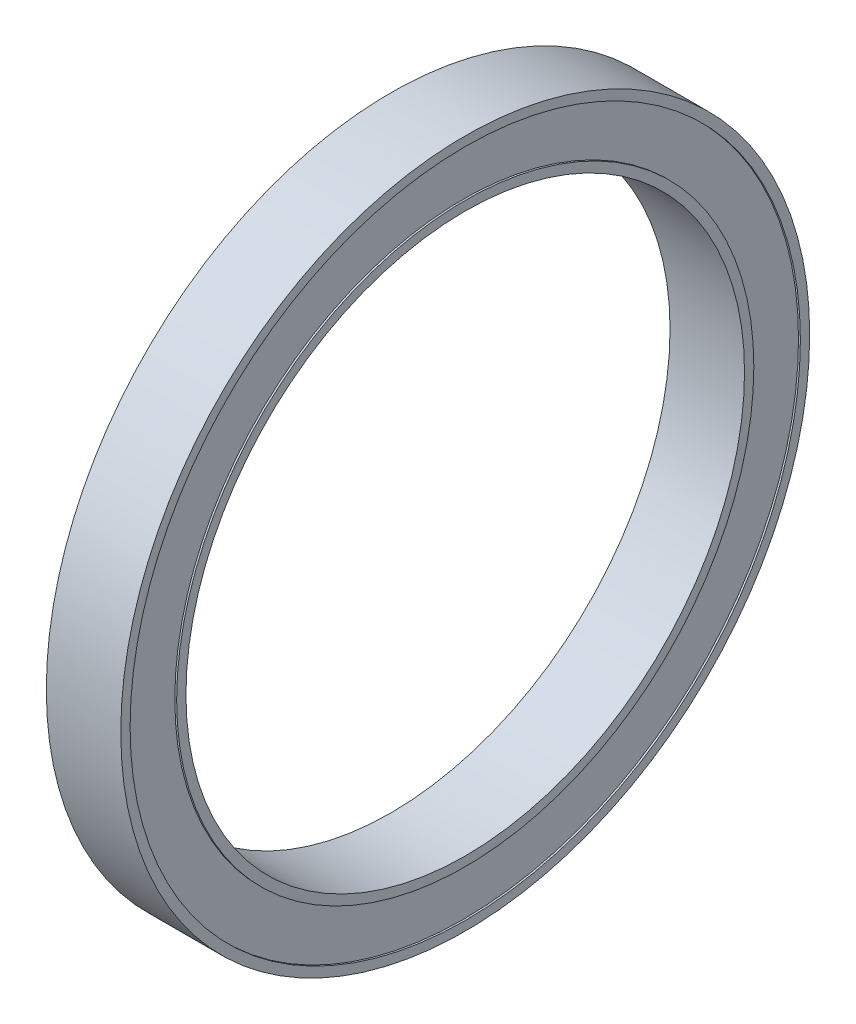
ISO-10303-21;
HEADER;
FILE_DESCRIPTION(('STEP AP214'),'2;1');
FILE_NAME('part.step','',(''),(''),'','','');
FILE_SCHEMA(('AUTOMOTIVE_DESIGN { 1 0 10303 214 1 1 1 1 }'));
ENDSEC;
DATA;
#1=APPLICATION_CONTEXT('core data for automotive mechanical design processes');
#2=APPLICATION_PROTOCOL_DEFINITION('international standard','automotive_design',2000,#1);
#3=PRODUCT_CONTEXT('',#1,'mechanical');
#4=PRODUCT('Part','Part','',(#3));
#5=PRODUCT_RELATED_PRODUCT_CATEGORY('part','',(#4));
#6=PRODUCT_DEFINITION_FORMATION('','',#4);
#7=PRODUCT_DEFINITION_CONTEXT('part definition',#1,'design');
#8=PRODUCT_DEFINITION('design','',#6,#7);
#9=PRODUCT_DEFINITION_SHAPE('','',#8);
#10=(LENGTH_UNIT() NAMED_UNIT(*) SI_UNIT(.MILLI.,.METRE.));
#11=(NAMED_UNIT(*) PLANE_ANGLE_UNIT() SI_UNIT($,.RADIAN.));
#12=(NAMED_UNIT(*) SI_UNIT($,.STERADIAN.) SOLID_ANGLE_UNIT());
#13=UNCERTAINTY_MEASURE_WITH_UNIT(LENGTH_MEASURE(1.E-05),#10,'distance_accuracy_value','');
#14=(GEOMETRIC_REPRESENTATION_CONTEXT(3) GLOBAL_UNCERTAINTY_ASSIGNED_CONTEXT((#13)) GLOBAL_UNIT_ASSIGNED_CONTEXT((#10,
#11,#12)) REPRESENTATION_CONTEXT('',''));
#15=CARTESIAN_POINT('',(0.,0.,0.));
#16=DIRECTION('',(0.,0.,1.));
#17=DIRECTION('',(1.,0.,0.));
#18=AXIS2_PLACEMENT_3D('',#15,#16,#17);
#19=CARTESIAN_POINT('',(4.,0.,0.));
#20=DIRECTION('',(1.,0.,0.));
#21=DIRECTION('',(0.,1.,0.));
#22=AXIS2_PLACEMENT_3D('',#19,#20,#21);
#23=PLANE('',#22);
#24=CARTESIAN_POINT('',(4.,0.,0.));
#25=DIRECTION('',(1.,0.,0.));
#26=DIRECTION('',(0.,0.,1.));
#27=AXIS2_PLACEMENT_3D('',#24,#25,#26);
#28=CIRCLE('',#27,15.);
#29=CARTESIAN_POINT('',(4.,0.,15.));
#30=VERTEX_POINT('',#29);
#31=EDGE_CURVE('E73',#30,#30,#28,.T.);
#32=ORIENTED_EDGE('',*,*,#31,.F.);
#33=EDGE_LOOP('',(#32));
#34=FACE_BOUND('',#33,.T.);
#35=CARTESIAN_POINT('',(4.,0.,0.));
#36=DIRECTION('',(-1.,0.,0.));
#37=DIRECTION('',(0.,0.,-1.));
#38=AXIS2_PLACEMENT_3D('',#35,#36,#37);
#39=CIRCLE('',#38,15.5);
#40=CARTESIAN_POINT('',(4.,0.,-15.5));
#41=VERTEX_POINT('',#40);
#42=EDGE_CURVE('E10',#41,#41,#39,.T.);
#43=ORIENTED_EDGE('',*,*,#42,.F.);
#44=EDGE_LOOP('',(#43));
#45=FACE_BOUND('',#44,.T.);
#46=ADVANCED_FACE('F15',(#34,#45),#23,.T.);
#47=CARTESIAN_POINT('',(4.,0.,0.));
#48=DIRECTION('',(-1.,0.,0.));
#49=DIRECTION('',(0.,0.,1.));
#50=AXIS2_PLACEMENT_3D('',#47,#48,#49);
#51=CYLINDRICAL_SURFACE('',#50,15.5);
#52=CARTESIAN_POINT('',(3.9,0.,0.));
#53=DIRECTION('',(1.,0.,0.));
#54=DIRECTION('',(0.,0.,-1.));
#55=AXIS2_PLACEMENT_3D('',#52,#53,#54);
#56=CIRCLE('',#55,15.5);
#57=CARTESIAN_POINT('',(3.9,0.,-15.5));
#58=VERTEX_POINT('',#57);
#59=EDGE_CURVE('E23',#58,#58,#56,.T.);
#60=ORIENTED_EDGE('',*,*,#59,.T.);
#61=EDGE_LOOP('',(#60));
#62=FACE_BOUND('',#61,.T.);
#63=ORIENTED_EDGE('',*,*,#42,.T.);
#64=EDGE_LOOP('',(#63));
#65=FACE_BOUND('',#64,.T.);
#66=ADVANCED_FACE('F17',(#62,#65),#51,.T.);
#67=CARTESIAN_POINT('',(3.9,0.,0.));
#68=DIRECTION('',(1.,0.,0.));
#69=DIRECTION('',(0.,1.,0.));
#70=AXIS2_PLACEMENT_3D('',#67,#68,#69);
#71=PLANE('',#70);
#72=ORIENTED_EDGE('',*,*,#59,.F.);
#73=EDGE_LOOP('',(#72));
#74=FACE_BOUND('',#73,.T.);
#75=CARTESIAN_POINT('',(3.9,0.,0.));
#76=DIRECTION('',(-1.,0.,0.));
#77=DIRECTION('',(0.,0.,-1.));
#78=AXIS2_PLACEMENT_3D('',#75,#76,#77);
#79=CIRCLE('',#78,18.);
#80=CARTESIAN_POINT('',(3.9,0.,-18.));
#81=VERTEX_POINT('',#80);
#82=EDGE_CURVE('E32',#81,#81,#79,.T.);
#83=ORIENTED_EDGE('',*,*,#82,.F.);
#84=EDGE_LOOP('',(#83));
#85=FACE_BOUND('',#84,.T.);
#86=ADVANCED_FACE('F89',(#74,#85),#71,.T.);
#87=CARTESIAN_POINT('',(4.,0.,0.));
#88=DIRECTION('',(-1.,0.,0.));
#89=DIRECTION('',(0.,0.,1.));
#90=AXIS2_PLACEMENT_3D('',#87,#88,#89);
#91=CYLINDRICAL_SURFACE('',#90,18.);
#92=ORIENTED_EDGE('',*,*,#82,.T.);
#93=EDGE_LOOP('',(#92));
#94=FACE_BOUND('',#93,.T.);
#95=CARTESIAN_POINT('',(4.,0.,0.));
#96=DIRECTION('',(1.,0.,0.));
#97=DIRECTION('',(0.,0.,-1.));
#98=AXIS2_PLACEMENT_3D('',#95,#96,#97);
#99=CIRCLE('',#98,18.);
#100=CARTESIAN_POINT('',(4.,0.,-18.));
#101=VERTEX_POINT('',#100);
#102=EDGE_CURVE('E39',#101,#101,#99,.T.);
#103=ORIENTED_EDGE('',*,*,#102,.T.);
#104=EDGE_LOOP('',(#103));
#105=FACE_BOUND('',#104,.T.);
#106=ADVANCED_FACE('F109',(#94,#105),#91,.F.);
#107=CARTESIAN_POINT('',(4.,0.,0.));
#108=DIRECTION('',(1.,0.,0.));
#109=DIRECTION('',(0.,1.,0.));
#110=AXIS2_PLACEMENT_3D('',#107,#108,#109);
#111=PLANE('',#110);
#112=ORIENTED_EDGE('',*,*,#102,.F.);
#113=EDGE_LOOP('',(#112));
#114=FACE_BOUND('',#113,.T.);
#115=CARTESIAN_POINT('',(4.,0.,0.));
#116=DIRECTION('',(-1.,0.,0.));
#117=DIRECTION('',(0.,0.,-1.));
#118=AXIS2_PLACEMENT_3D('',#115,#116,#117);
#119=CIRCLE('',#118,18.5);
#120=CARTESIAN_POINT('',(4.,0.,-18.5));
#121=VERTEX_POINT('',#120);
#122=EDGE_CURVE('E45',#121,#121,#119,.T.);
#123=ORIENTED_EDGE('',*,*,#122,.F.);
#124=EDGE_LOOP('',(#123));
#125=FACE_BOUND('',#124,.T.);
#126=ADVANCED_FACE('F107',(#114,#125),#111,.T.);
#127=CARTESIAN_POINT('',(4.,0.,0.));
#128=DIRECTION('',(-1.,0.,0.));
#129=DIRECTION('',(0.,0.,1.));
#130=AXIS2_PLACEMENT_3D('',#127,#128,#129);
#131=CYLINDRICAL_SURFACE('',#130,18.5);
#132=CARTESIAN_POINT('',(0.,0.,0.));
#133=DIRECTION('',(1.,0.,0.));
#134=DIRECTION('',(0.,0.,-1.));
#135=AXIS2_PLACEMENT_3D('',#132,#133,#134);
#136=CIRCLE('',#135,18.5);
#137=CARTESIAN_POINT('',(0.,0.,-18.5));
#138=VERTEX_POINT('',#137);
#139=EDGE_CURVE('E46',#138,#138,#136,.T.);
#140=ORIENTED_EDGE('',*,*,#139,.T.);
#141=EDGE_LOOP('',(#140));
#142=FACE_BOUND('',#141,.T.);
#143=ORIENTED_EDGE('',*,*,#122,.T.);
#144=EDGE_LOOP('',(#143));
#145=FACE_BOUND('',#144,.T.);
#146=ADVANCED_FACE('F92',(#142,#145),#131,.T.);
#147=CARTESIAN_POINT('',(0.,0.,0.));
#148=DIRECTION('',(1.,0.,0.));
#149=DIRECTION('',(0.,1.,0.));
#150=AXIS2_PLACEMENT_3D('',#147,#148,#149);
#151=PLANE('',#150);
#152=CARTESIAN_POINT('',(0.,0.,0.));
#153=DIRECTION('',(-1.,0.,0.));
#154=DIRECTION('',(0.,0.,-1.));
#155=AXIS2_PLACEMENT_3D('',#152,#153,#154);
#156=CIRCLE('',#155,18.);
#157=CARTESIAN_POINT('',(0.,0.,-18.));
#158=VERTEX_POINT('',#157);
#159=EDGE_CURVE('E50',#158,#158,#156,.T.);
#160=ORIENTED_EDGE('',*,*,#159,.F.);
#161=EDGE_LOOP('',(#160));
#162=FACE_BOUND('',#161,.T.);
#163=ORIENTED_EDGE('',*,*,#139,.F.);
#164=EDGE_LOOP('',(#163));
#165=FACE_BOUND('',#164,.T.);
#166=ADVANCED_FACE('F98',(#162,#165),#151,.F.);
#167=CARTESIAN_POINT('',(0.1,0.,0.));
#168=DIRECTION('',(-1.,0.,0.));
#169=DIRECTION('',(0.,0.,1.));
#170=AXIS2_PLACEMENT_3D('',#167,#168,#169);
#171=CYLINDRICAL_SURFACE('',#170,18.);
#172=ORIENTED_EDGE('',*,*,#159,.T.);
#173=EDGE_LOOP('',(#172));
#174=FACE_BOUND('',#173,.T.);
#175=CARTESIAN_POINT('',(0.1,0.,0.));
#176=DIRECTION('',(1.,0.,0.));
#177=DIRECTION('',(0.,0.,-1.));
#178=AXIS2_PLACEMENT_3D('',#175,#176,#177);
#179=CIRCLE('',#178,18.);
#180=CARTESIAN_POINT('',(0.1,0.,-18.));
#181=VERTEX_POINT('',#180);
#182=EDGE_CURVE('E54',#181,#181,#179,.T.);
#183=ORIENTED_EDGE('',*,*,#182,.T.);
#184=EDGE_LOOP('',(#183));
#185=FACE_BOUND('',#184,.T.);
#186=ADVANCED_FACE('F94',(#174,#185),#171,.F.);
#187=CARTESIAN_POINT('',(0.1,0.,0.));
#188=DIRECTION('',(1.,0.,0.));
#189=DIRECTION('',(0.,1.,0.));
#190=AXIS2_PLACEMENT_3D('',#187,#188,#189);
#191=PLANE('',#190);
#192=CARTESIAN_POINT('',(0.1,0.,0.));
#193=DIRECTION('',(-1.,0.,0.));
#194=DIRECTION('',(0.,0.,-1.));
#195=AXIS2_PLACEMENT_3D('',#192,#193,#194);
#196=CIRCLE('',#195,15.5);
#197=CARTESIAN_POINT('',(0.1,0.,-15.5));
#198=VERTEX_POINT('',#197);
#199=EDGE_CURVE('E55',#198,#198,#196,.T.);
#200=ORIENTED_EDGE('',*,*,#199,.F.);
#201=EDGE_LOOP('',(#200));
#202=FACE_BOUND('',#201,.T.);
#203=ORIENTED_EDGE('',*,*,#182,.F.);
#204=EDGE_LOOP('',(#203));
#205=FACE_BOUND('',#204,.T.);
#206=ADVANCED_FACE('F97',(#202,#205),#191,.F.);
#207=CARTESIAN_POINT('',(0.1,0.,0.));
#208=DIRECTION('',(-1.,0.,0.));
#209=DIRECTION('',(0.,0.,1.));
#210=AXIS2_PLACEMENT_3D('',#207,#208,#209);
#211=CYLINDRICAL_SURFACE('',#210,15.5);
#212=CARTESIAN_POINT('',(0.,0.,0.));
#213=DIRECTION('',(1.,0.,0.));
#214=DIRECTION('',(0.,0.,-1.));
#215=AXIS2_PLACEMENT_3D('',#212,#213,#214);
#216=CIRCLE('',#215,15.5);
#217=CARTESIAN_POINT('',(0.,0.,-15.5));
#218=VERTEX_POINT('',#217);
#219=EDGE_CURVE('E59',#218,#218,#216,.T.);
#220=ORIENTED_EDGE('',*,*,#219,.T.);
#221=EDGE_LOOP('',(#220));
#222=FACE_BOUND('',#221,.T.);
#223=ORIENTED_EDGE('',*,*,#199,.T.);
#224=EDGE_LOOP('',(#223));
#225=FACE_BOUND('',#224,.T.);
#226=ADVANCED_FACE('F102',(#222,#225),#211,.T.);
#227=CARTESIAN_POINT('',(0.,0.,0.));
#228=DIRECTION('',(1.,0.,0.));
#229=DIRECTION('',(0.,1.,0.));
#230=AXIS2_PLACEMENT_3D('',#227,#228,#229);
#231=PLANE('',#230);
#232=CARTESIAN_POINT('',(0.,0.,0.));
#233=DIRECTION('',(-1.,0.,0.));
#234=DIRECTION('',(0.,0.,-1.));
#235=AXIS2_PLACEMENT_3D('',#232,#233,#234);
#236=CIRCLE('',#235,15.);
#237=CARTESIAN_POINT('',(0.,0.,-15.));
#238=VERTEX_POINT('',#237);
#239=EDGE_CURVE('E66',#238,#238,#236,.T.);
#240=ORIENTED_EDGE('',*,*,#239,.F.);
#241=EDGE_LOOP('',(#240));
#242=FACE_BOUND('',#241,.T.);
#243=ORIENTED_EDGE('',*,*,#219,.F.);
#244=EDGE_LOOP('',(#243));
#245=FACE_BOUND('',#244,.T.);
#246=ADVANCED_FACE('F157',(#242,#245),#231,.F.);
#247=CARTESIAN_POINT('',(4.,0.,0.));
#248=DIRECTION('',(-1.,0.,0.));
#249=DIRECTION('',(0.,0.,1.));
#250=AXIS2_PLACEMENT_3D('',#247,#248,#249);
#251=CYLINDRICAL_SURFACE('',#250,15.);
#252=ORIENTED_EDGE('',*,*,#239,.T.);
#253=EDGE_LOOP('',(#252));
#254=FACE_BOUND('',#253,.T.);
#255=ORIENTED_EDGE('',*,*,#31,.T.);
#256=EDGE_LOOP('',(#255));
#257=FACE_BOUND('',#256,.T.);
#258=ADVANCED_FACE('F80',(#254,#257),#251,.F.);
#259=CLOSED_SHELL('',(#46,#66,#86,#106,#126,#146,#166,#186,#206,#226,#246,#258));
#260=MANIFOLD_SOLID_BREP('B1',#259);
#261=ADVANCED_BREP_SHAPE_REPRESENTATION('',(#18,#260),#14);
#262=SHAPE_DEFINITION_REPRESENTATION(#9,#261);
ENDSEC;
END-ISO-10303-21;
